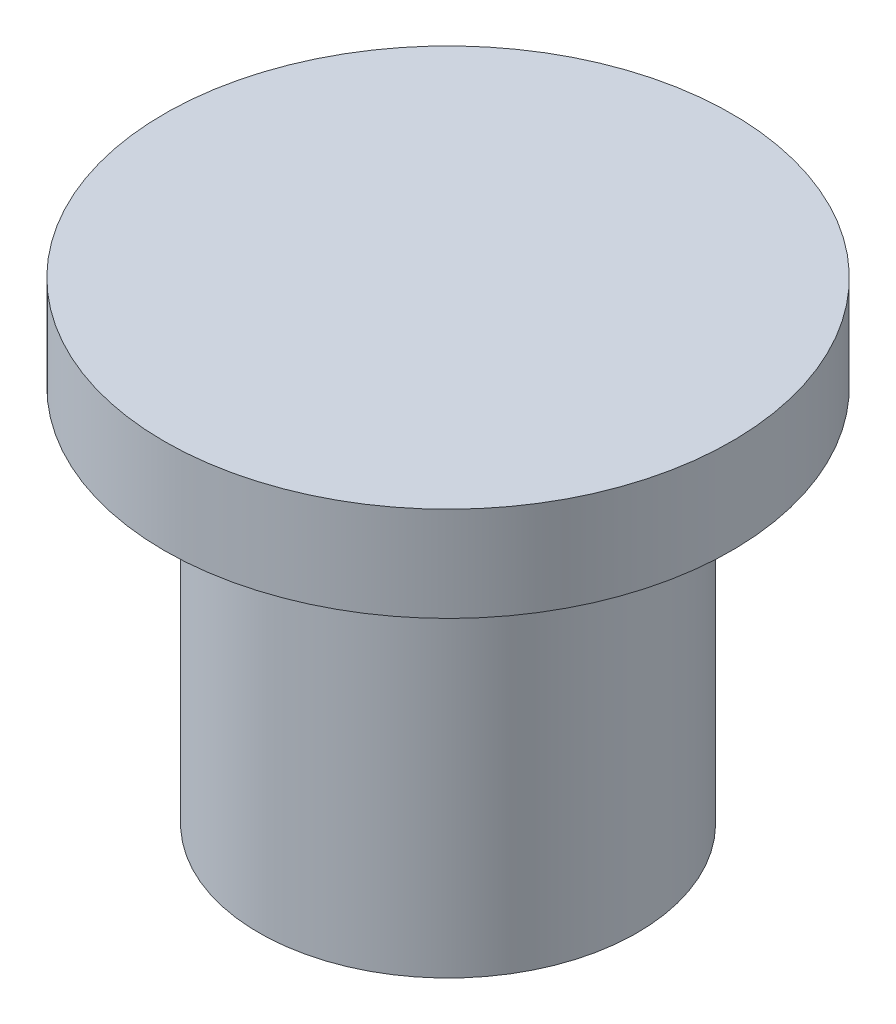
ISO-10303-21;
HEADER;
FILE_DESCRIPTION(('STEP AP214'),'2;1');
FILE_NAME('part.step','',(''),(''),'','','');
FILE_SCHEMA(('AUTOMOTIVE_DESIGN { 1 0 10303 214 1 1 1 1 }'));
ENDSEC;
DATA;
#1=APPLICATION_CONTEXT('core data for automotive mechanical design processes');
#2=APPLICATION_PROTOCOL_DEFINITION('international standard','automotive_design',2000,#1);
#3=PRODUCT_CONTEXT('',#1,'mechanical');
#4=PRODUCT('Part','Part','',(#3));
#5=PRODUCT_RELATED_PRODUCT_CATEGORY('part','',(#4));
#6=PRODUCT_DEFINITION_FORMATION('','',#4);
#7=PRODUCT_DEFINITION_CONTEXT('part definition',#1,'design');
#8=PRODUCT_DEFINITION('design','',#6,#7);
#9=PRODUCT_DEFINITION_SHAPE('','',#8);
#10=(LENGTH_UNIT() NAMED_UNIT(*) SI_UNIT(.MILLI.,.METRE.));
#11=(NAMED_UNIT(*) PLANE_ANGLE_UNIT() SI_UNIT($,.RADIAN.));
#12=(NAMED_UNIT(*) SI_UNIT($,.STERADIAN.) SOLID_ANGLE_UNIT());
#13=UNCERTAINTY_MEASURE_WITH_UNIT(LENGTH_MEASURE(1.E-05),#10,'distance_accuracy_value','');
#14=(GEOMETRIC_REPRESENTATION_CONTEXT(3) GLOBAL_UNCERTAINTY_ASSIGNED_CONTEXT((#13)) GLOBAL_UNIT_ASSIGNED_CONTEXT((#10,
#11,#12)) REPRESENTATION_CONTEXT('',''));
#15=CARTESIAN_POINT('',(0.,0.,0.));
#16=DIRECTION('',(0.,0.,1.));
#17=DIRECTION('',(1.,0.,0.));
#18=AXIS2_PLACEMENT_3D('',#15,#16,#17);
#19=CARTESIAN_POINT('',(0.,2.5,0.));
#20=DIRECTION('',(0.,-1.,0.));
#21=DIRECTION('',(0.,0.,-1.));
#22=AXIS2_PLACEMENT_3D('',#19,#20,#21);
#23=CYLINDRICAL_SURFACE('',#22,7.5);
#24=CARTESIAN_POINT('',(0.,2.5,0.));
#25=DIRECTION('',(0.,1.,0.));
#26=DIRECTION('',(0.,0.,1.));
#27=AXIS2_PLACEMENT_3D('',#24,#25,#26);
#28=CIRCLE('',#27,7.5);
#29=CARTESIAN_POINT('',(0.,2.5,7.5));
#30=VERTEX_POINT('',#29);
#31=EDGE_CURVE('E39',#30,#30,#28,.T.);
#32=ORIENTED_EDGE('',*,*,#31,.F.);
#33=EDGE_LOOP('',(#32));
#34=FACE_BOUND('',#33,.T.);
#35=CARTESIAN_POINT('',(0.,0.,0.));
#36=DIRECTION('',(0.,1.,0.));
#37=DIRECTION('',(0.,0.,1.));
#38=AXIS2_PLACEMENT_3D('',#35,#36,#37);
#39=CIRCLE('',#38,7.5);
#40=CARTESIAN_POINT('',(0.,0.,7.5));
#41=VERTEX_POINT('',#40);
#42=EDGE_CURVE('E35',#41,#41,#39,.T.);
#43=ORIENTED_EDGE('',*,*,#42,.T.);
#44=EDGE_LOOP('',(#43));
#45=FACE_BOUND('',#44,.T.);
#46=ADVANCED_FACE('F32',(#34,#45),#23,.T.);
#47=CARTESIAN_POINT('',(0.,2.5,0.));
#48=DIRECTION('',(0.,1.,0.));
#49=DIRECTION('',(0.,0.,1.));
#50=AXIS2_PLACEMENT_3D('',#47,#48,#49);
#51=PLANE('',#50);
#52=ORIENTED_EDGE('',*,*,#31,.T.);
#53=EDGE_LOOP('',(#52));
#54=FACE_BOUND('',#53,.T.);
#55=ADVANCED_FACE('F56',(#54),#51,.T.);
#56=CARTESIAN_POINT('',(0.,0.,0.));
#57=DIRECTION('',(0.,1.,0.));
#58=DIRECTION('',(0.,0.,1.));
#59=AXIS2_PLACEMENT_3D('',#56,#57,#58);
#60=PLANE('',#59);
#61=CARTESIAN_POINT('',(0.,0.,0.));
#62=DIRECTION('',(0.,-1.,0.));
#63=DIRECTION('',(0.,0.,-1.));
#64=AXIS2_PLACEMENT_3D('',#61,#62,#63);
#65=CIRCLE('',#64,5.);
#66=CARTESIAN_POINT('',(0.,0.,-5.));
#67=VERTEX_POINT('',#66);
#68=EDGE_CURVE('E10',#67,#67,#65,.T.);
#69=ORIENTED_EDGE('',*,*,#68,.F.);
#70=EDGE_LOOP('',(#69));
#71=FACE_BOUND('',#70,.T.);
#72=ORIENTED_EDGE('',*,*,#42,.F.);
#73=EDGE_LOOP('',(#72));
#74=FACE_BOUND('',#73,.T.);
#75=ADVANCED_FACE('F53',(#71,#74),#60,.F.);
#76=CARTESIAN_POINT('',(0.,-10.,0.));
#77=DIRECTION('',(0.,1.,0.));
#78=DIRECTION('',(0.,0.,1.));
#79=AXIS2_PLACEMENT_3D('',#76,#77,#78);
#80=CYLINDRICAL_SURFACE('',#79,5.);
#81=CARTESIAN_POINT('',(0.,-10.,0.));
#82=DIRECTION('',(0.,-1.,0.));
#83=DIRECTION('',(0.,0.,-1.));
#84=AXIS2_PLACEMENT_3D('',#81,#82,#83);
#85=CIRCLE('',#84,5.);
#86=CARTESIAN_POINT('',(0.,-10.,-5.));
#87=VERTEX_POINT('',#86);
#88=EDGE_CURVE('E45',#87,#87,#85,.T.);
#89=ORIENTED_EDGE('',*,*,#88,.F.);
#90=EDGE_LOOP('',(#89));
#91=FACE_BOUND('',#90,.T.);
#92=ORIENTED_EDGE('',*,*,#68,.T.);
#93=EDGE_LOOP('',(#92));
#94=FACE_BOUND('',#93,.T.);
#95=ADVANCED_FACE('F55',(#91,#94),#80,.T.);
#96=CARTESIAN_POINT('',(0.,-10.,0.));
#97=DIRECTION('',(0.,-1.,0.));
#98=DIRECTION('',(0.,0.,-1.));
#99=AXIS2_PLACEMENT_3D('',#96,#97,#98);
#100=PLANE('',#99);
#101=ORIENTED_EDGE('',*,*,#88,.T.);
#102=EDGE_LOOP('',(#101));
#103=FACE_BOUND('',#102,.T.);
#104=ADVANCED_FACE('F62',(#103),#100,.T.);
#105=CLOSED_SHELL('',(#46,#55,#75,#95,#104));
#106=MANIFOLD_SOLID_BREP('B2',#105);
#107=ADVANCED_BREP_SHAPE_REPRESENTATION('',(#18,#106),#14);
#108=SHAPE_DEFINITION_REPRESENTATION(#9,#107);
ENDSEC;
END-ISO-10303-21;
